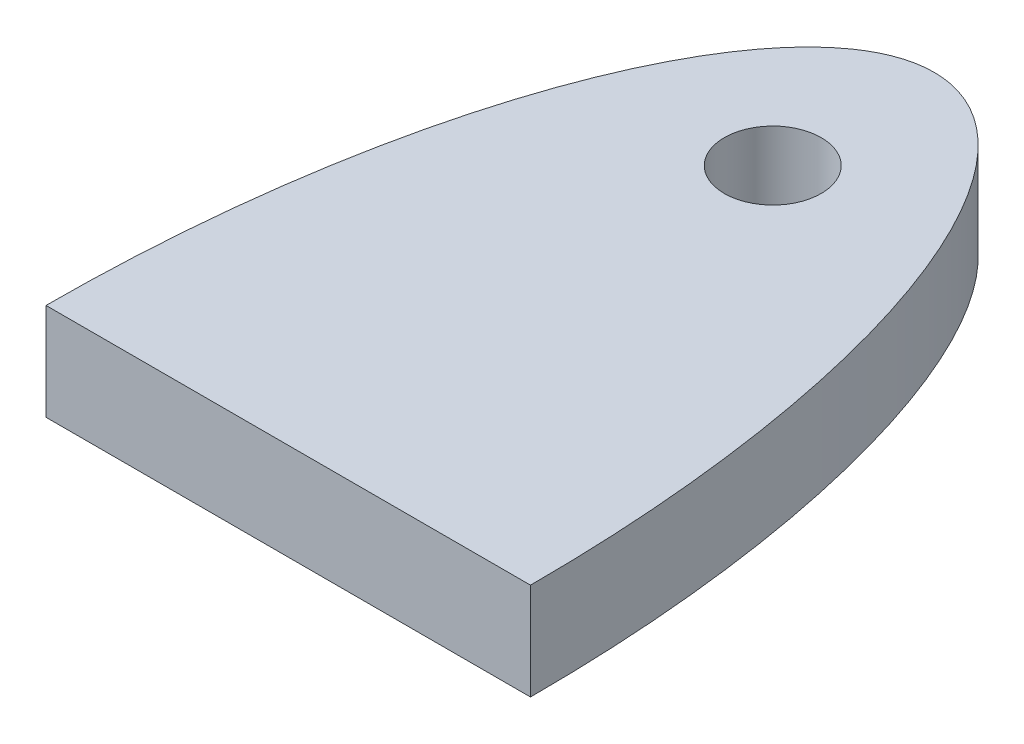
ISO-10303-21;
HEADER;
FILE_DESCRIPTION(('STEP AP214'),'2;1');
FILE_NAME('part.step','',(''),(''),'','','');
FILE_SCHEMA(('AUTOMOTIVE_DESIGN { 1 0 10303 214 1 1 1 1 }'));
ENDSEC;
DATA;
#1=APPLICATION_CONTEXT('core data for automotive mechanical design processes');
#2=APPLICATION_PROTOCOL_DEFINITION('international standard','automotive_design',2000,#1);
#3=PRODUCT_CONTEXT('',#1,'mechanical');
#4=PRODUCT('Part','Part','',(#3));
#5=PRODUCT_RELATED_PRODUCT_CATEGORY('part','',(#4));
#6=PRODUCT_DEFINITION_FORMATION('','',#4);
#7=PRODUCT_DEFINITION_CONTEXT('part definition',#1,'design');
#8=PRODUCT_DEFINITION('design','',#6,#7);
#9=PRODUCT_DEFINITION_SHAPE('','',#8);
#10=(LENGTH_UNIT() NAMED_UNIT(*) SI_UNIT(.MILLI.,.METRE.));
#11=(NAMED_UNIT(*) PLANE_ANGLE_UNIT() SI_UNIT($,.RADIAN.));
#12=(NAMED_UNIT(*) SI_UNIT($,.STERADIAN.) SOLID_ANGLE_UNIT());
#13=UNCERTAINTY_MEASURE_WITH_UNIT(LENGTH_MEASURE(1.E-05),#10,'distance_accuracy_value','');
#14=(GEOMETRIC_REPRESENTATION_CONTEXT(3) GLOBAL_UNCERTAINTY_ASSIGNED_CONTEXT((#13)) GLOBAL_UNIT_ASSIGNED_CONTEXT((#10,
#11,#12)) REPRESENTATION_CONTEXT('',''));
#15=CARTESIAN_POINT('',(0.,0.,0.));
#16=DIRECTION('',(0.,0.,1.));
#17=DIRECTION('',(1.,0.,0.));
#18=AXIS2_PLACEMENT_3D('',#15,#16,#17);
#19=CARTESIAN_POINT('',(7.5,3.,0.));
#20=DIRECTION('',(0.,1.,0.));
#21=DIRECTION('',(0.,0.,-1.));
#22=AXIS2_PLACEMENT_3D('',#19,#20,#21);
#23=ELLIPSE('',#22,20.,7.5);
#24=DIRECTION('',(0.,-1.,0.));
#25=VECTOR('',#24,1.);
#26=SURFACE_OF_LINEAR_EXTRUSION('',#23,#25);
#27=CARTESIAN_POINT('',(7.5,0.,0.));
#28=DIRECTION('',(0.,1.,0.));
#29=DIRECTION('',(0.,0.,-1.));
#30=AXIS2_PLACEMENT_3D('',#27,#28,#29);
#31=ELLIPSE('',#30,20.,7.5);
#32=CARTESIAN_POINT('',(15.,0.,0.));
#33=VERTEX_POINT('',#32);
#34=CARTESIAN_POINT('',(0.,0.,0.));
#35=VERTEX_POINT('',#34);
#36=EDGE_CURVE('E73',#33,#35,#31,.T.);
#37=ORIENTED_EDGE('',*,*,#36,.T.);
#38=DIRECTION('',(0.,-1.,0.));
#39=VECTOR('',#38,1.);
#40=CARTESIAN_POINT('',(0.,3.,0.));
#41=LINE('',#40,#39);
#42=CARTESIAN_POINT('',(0.,3.,0.));
#43=VERTEX_POINT('',#42);
#44=EDGE_CURVE('E11',#43,#35,#41,.T.);
#45=ORIENTED_EDGE('',*,*,#44,.F.);
#46=CARTESIAN_POINT('',(15.,3.,0.));
#47=VERTEX_POINT('',#46);
#48=EDGE_CURVE('E72',#47,#43,#23,.T.);
#49=ORIENTED_EDGE('',*,*,#48,.F.);
#50=DIRECTION('',(0.,-1.,0.));
#51=VECTOR('',#50,1.);
#52=CARTESIAN_POINT('',(15.,3.,0.));
#53=LINE('',#52,#51);
#54=EDGE_CURVE('E49',#47,#33,#53,.T.);
#55=ORIENTED_EDGE('',*,*,#54,.T.);
#56=EDGE_LOOP('',(#37,#45,#49,#55));
#57=FACE_BOUND('',#56,.T.);
#58=ADVANCED_FACE('F39',(#57),#26,.F.);
#59=CARTESIAN_POINT('',(0.,3.,0.));
#60=DIRECTION('',(0.,0.,-1.));
#61=DIRECTION('',(-1.,0.,0.));
#62=AXIS2_PLACEMENT_3D('',#59,#60,#61);
#63=PLANE('',#62);
#64=DIRECTION('',(1.,0.,0.));
#65=VECTOR('',#64,1.);
#66=CARTESIAN_POINT('',(0.,0.,0.));
#67=LINE('',#66,#65);
#68=EDGE_CURVE('E64',#35,#33,#67,.T.);
#69=ORIENTED_EDGE('',*,*,#68,.T.);
#70=ORIENTED_EDGE('',*,*,#54,.F.);
#71=DIRECTION('',(1.,0.,0.));
#72=VECTOR('',#71,1.);
#73=CARTESIAN_POINT('',(0.,3.,0.));
#74=LINE('',#73,#72);
#75=EDGE_CURVE('E56',#43,#47,#74,.T.);
#76=ORIENTED_EDGE('',*,*,#75,.F.);
#77=ORIENTED_EDGE('',*,*,#44,.T.);
#78=EDGE_LOOP('',(#69,#70,#76,#77));
#79=FACE_BOUND('',#78,.T.);
#80=ADVANCED_FACE('F67',(#79),#63,.F.);
#81=CARTESIAN_POINT('',(7.5,3.,0.));
#82=DIRECTION('',(0.,1.,0.));
#83=DIRECTION('',(0.,0.,1.));
#84=AXIS2_PLACEMENT_3D('',#81,#82,#83);
#85=PLANE('',#84);
#86=CARTESIAN_POINT('',(7.5,3.,-15.));
#87=DIRECTION('',(0.,1.,0.));
#88=DIRECTION('',(0.,0.,1.));
#89=AXIS2_PLACEMENT_3D('',#86,#87,#88);
#90=CIRCLE('',#89,1.5);
#91=CARTESIAN_POINT('',(7.5,3.,-13.5));
#92=VERTEX_POINT('',#91);
#93=EDGE_CURVE('E83',#92,#92,#90,.T.);
#94=ORIENTED_EDGE('',*,*,#93,.F.);
#95=EDGE_LOOP('',(#94));
#96=FACE_BOUND('',#95,.T.);
#97=ORIENTED_EDGE('',*,*,#48,.T.);
#98=ORIENTED_EDGE('',*,*,#75,.T.);
#99=EDGE_LOOP('',(#97,#98));
#100=FACE_BOUND('',#99,.T.);
#101=ADVANCED_FACE('F96',(#96,#100),#85,.T.);
#102=CARTESIAN_POINT('',(7.5,0.,0.));
#103=DIRECTION('',(0.,1.,0.));
#104=DIRECTION('',(0.,0.,1.));
#105=AXIS2_PLACEMENT_3D('',#102,#103,#104);
#106=PLANE('',#105);
#107=CARTESIAN_POINT('',(7.5,0.,-15.));
#108=DIRECTION('',(0.,1.,0.));
#109=DIRECTION('',(0.,0.,1.));
#110=AXIS2_PLACEMENT_3D('',#107,#108,#109);
#111=CIRCLE('',#110,1.5);
#112=CARTESIAN_POINT('',(7.5,0.,-13.5));
#113=VERTEX_POINT('',#112);
#114=EDGE_CURVE('E79',#113,#113,#111,.T.);
#115=ORIENTED_EDGE('',*,*,#114,.T.);
#116=EDGE_LOOP('',(#115));
#117=FACE_BOUND('',#116,.T.);
#118=ORIENTED_EDGE('',*,*,#36,.F.);
#119=ORIENTED_EDGE('',*,*,#68,.F.);
#120=EDGE_LOOP('',(#118,#119));
#121=FACE_BOUND('',#120,.T.);
#122=ADVANCED_FACE('F77',(#117,#121),#106,.F.);
#123=CARTESIAN_POINT('',(7.5,0.,-15.));
#124=DIRECTION('',(0.,1.,0.));
#125=DIRECTION('',(0.,0.,1.));
#126=AXIS2_PLACEMENT_3D('',#123,#124,#125);
#127=CYLINDRICAL_SURFACE('',#126,1.5);
#128=ORIENTED_EDGE('',*,*,#114,.F.);
#129=EDGE_LOOP('',(#128));
#130=FACE_BOUND('',#129,.T.);
#131=ORIENTED_EDGE('',*,*,#93,.T.);
#132=EDGE_LOOP('',(#131));
#133=FACE_BOUND('',#132,.T.);
#134=ADVANCED_FACE('F94',(#130,#133),#127,.F.);
#135=CLOSED_SHELL('',(#58,#80,#101,#122,#134));
#136=MANIFOLD_SOLID_BREP('B2',#135);
#137=ADVANCED_BREP_SHAPE_REPRESENTATION('',(#18,#136),#14);
#138=SHAPE_DEFINITION_REPRESENTATION(#9,#137);
ENDSEC;
END-ISO-10303-21;
